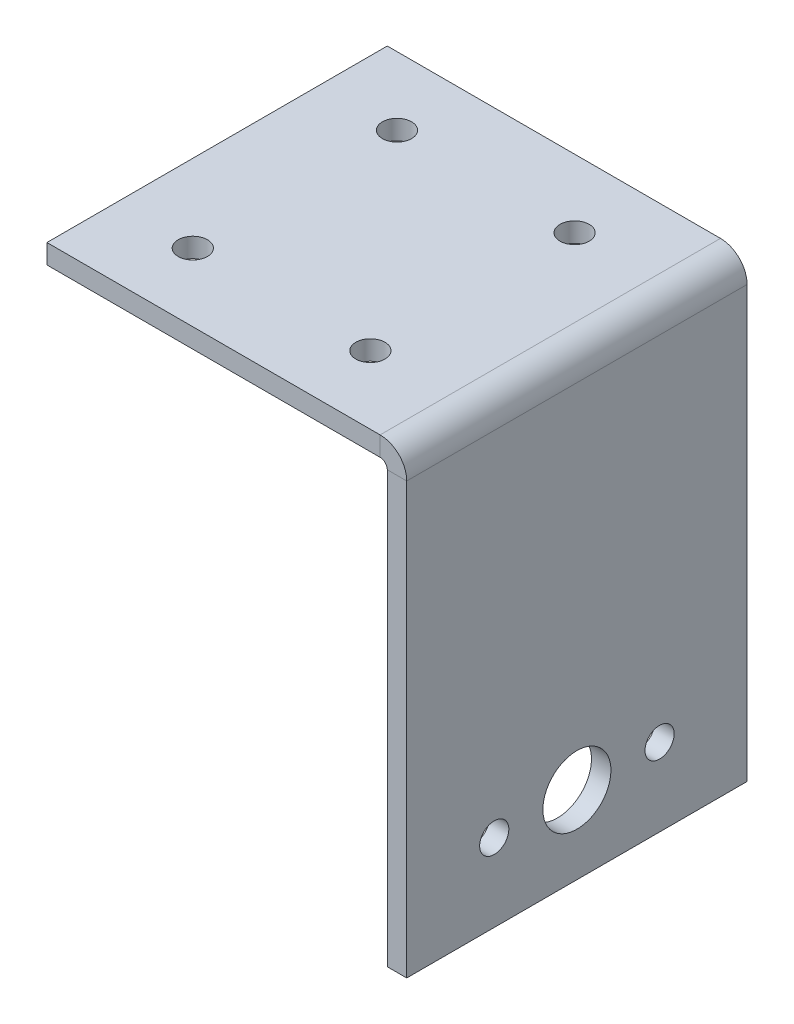
ISO-10303-21;
HEADER;
FILE_DESCRIPTION(('STEP AP214'),'2;1');
FILE_NAME('part.step','',(''),(''),'','','');
FILE_SCHEMA(('AUTOMOTIVE_DESIGN { 1 0 10303 214 1 1 1 1 }'));
ENDSEC;
DATA;
#1=APPLICATION_CONTEXT('core data for automotive mechanical design processes');
#2=APPLICATION_PROTOCOL_DEFINITION('international standard','automotive_design',2000,#1);
#3=PRODUCT_CONTEXT('',#1,'mechanical');
#4=PRODUCT('Part','Part','',(#3));
#5=PRODUCT_RELATED_PRODUCT_CATEGORY('part','',(#4));
#6=PRODUCT_DEFINITION_FORMATION('','',#4);
#7=PRODUCT_DEFINITION_CONTEXT('part definition',#1,'design');
#8=PRODUCT_DEFINITION('design','',#6,#7);
#9=PRODUCT_DEFINITION_SHAPE('','',#8);
#10=(LENGTH_UNIT() NAMED_UNIT(*) SI_UNIT(.MILLI.,.METRE.));
#11=(NAMED_UNIT(*) PLANE_ANGLE_UNIT() SI_UNIT($,.RADIAN.));
#12=(NAMED_UNIT(*) SI_UNIT($,.STERADIAN.) SOLID_ANGLE_UNIT());
#13=UNCERTAINTY_MEASURE_WITH_UNIT(LENGTH_MEASURE(1.E-05),#10,'distance_accuracy_value','');
#14=(GEOMETRIC_REPRESENTATION_CONTEXT(3) GLOBAL_UNCERTAINTY_ASSIGNED_CONTEXT((#13)) GLOBAL_UNIT_ASSIGNED_CONTEXT((#10,
#11,#12)) REPRESENTATION_CONTEXT('',''));
#15=CARTESIAN_POINT('',(0.,0.,0.));
#16=DIRECTION('',(0.,0.,1.));
#17=DIRECTION('',(1.,0.,0.));
#18=AXIS2_PLACEMENT_3D('',#15,#16,#17);
#19=CARTESIAN_POINT('',(-0.736599999999997,0.,35.));
#20=DIRECTION('',(0.,0.,1.));
#21=DIRECTION('',(1.,0.,0.));
#22=AXIS2_PLACEMENT_3D('',#19,#20,#21);
#23=PLANE('',#22);
#24=DIRECTION('',(0.,1.,0.));
#25=VECTOR('',#24,1.);
#26=CARTESIAN_POINT('',(-0.736599999999997,0.,35.));
#27=LINE('',#26,#25);
#28=CARTESIAN_POINT('',(-0.736599999999997,0.,35.));
#29=VERTEX_POINT('',#28);
#30=CARTESIAN_POINT('',(-0.736599999999993,2.,35.));
#31=VERTEX_POINT('',#30);
#32=EDGE_CURVE('E11',#29,#31,#27,.T.);
#33=ORIENTED_EDGE('',*,*,#32,.F.);
#34=CARTESIAN_POINT('',(-0.736599999999998,-0.7366,35.));
#35=DIRECTION('',(0.,0.,1.));
#36=DIRECTION('',(1.,0.,0.));
#37=AXIS2_PLACEMENT_3D('',#34,#35,#36);
#38=CIRCLE('',#37,0.7366);
#39=CARTESIAN_POINT('',(0.,-0.736599999999999,35.));
#40=VERTEX_POINT('',#39);
#41=EDGE_CURVE('E126',#29,#40,#38,.F.);
#42=ORIENTED_EDGE('',*,*,#41,.T.);
#43=DIRECTION('',(-1.,0.,0.));
#44=VECTOR('',#43,1.);
#45=CARTESIAN_POINT('',(2.,-0.736599999999999,35.));
#46=LINE('',#45,#44);
#47=CARTESIAN_POINT('',(2.,-0.736599999999999,35.));
#48=VERTEX_POINT('',#47);
#49=EDGE_CURVE('E44',#48,#40,#46,.T.);
#50=ORIENTED_EDGE('',*,*,#49,.F.);
#51=CARTESIAN_POINT('',(-0.736599999999998,-0.7366,35.));
#52=DIRECTION('',(0.,0.,1.));
#53=DIRECTION('',(1.,0.,0.));
#54=AXIS2_PLACEMENT_3D('',#51,#52,#53);
#55=CIRCLE('',#54,2.7366);
#56=EDGE_CURVE('E133',#31,#48,#55,.F.);
#57=ORIENTED_EDGE('',*,*,#56,.F.);
#58=EDGE_LOOP('',(#33,#42,#50,#57));
#59=FACE_BOUND('',#58,.T.);
#60=ADVANCED_FACE('F36',(#59),#23,.T.);
#61=CARTESIAN_POINT('',(2.,-0.736599999999999,35.));
#62=DIRECTION('',(0.,0.,1.));
#63=DIRECTION('',(1.,0.,0.));
#64=AXIS2_PLACEMENT_3D('',#61,#62,#63);
#65=PLANE('',#64);
#66=DIRECTION('',(1.,0.,0.));
#67=VECTOR('',#66,1.);
#68=CARTESIAN_POINT('',(-35.,0.,35.));
#69=LINE('',#68,#67);
#70=CARTESIAN_POINT('',(-35.,0.,35.));
#71=VERTEX_POINT('',#70);
#72=EDGE_CURVE('E121',#71,#29,#69,.T.);
#73=ORIENTED_EDGE('',*,*,#72,.T.);
#74=ORIENTED_EDGE('',*,*,#32,.T.);
#75=DIRECTION('',(1.,0.,0.));
#76=VECTOR('',#75,1.);
#77=CARTESIAN_POINT('',(-35.,2.,35.));
#78=LINE('',#77,#76);
#79=CARTESIAN_POINT('',(-35.,2.,35.));
#80=VERTEX_POINT('',#79);
#81=EDGE_CURVE('E131',#80,#31,#78,.T.);
#82=ORIENTED_EDGE('',*,*,#81,.F.);
#83=DIRECTION('',(0.,1.,0.));
#84=VECTOR('',#83,1.);
#85=CARTESIAN_POINT('',(-35.,0.,35.));
#86=LINE('',#85,#84);
#87=EDGE_CURVE('E112',#71,#80,#86,.T.);
#88=ORIENTED_EDGE('',*,*,#87,.F.);
#89=EDGE_LOOP('',(#73,#74,#82,#88));
#90=FACE_BOUND('',#89,.T.);
#91=ADVANCED_FACE('F129',(#90),#65,.T.);
#92=CARTESIAN_POINT('',(0.,-0.736599999999999,0.));
#93=DIRECTION('',(0.,0.,-1.));
#94=DIRECTION('',(-1.,0.,0.));
#95=AXIS2_PLACEMENT_3D('',#92,#93,#94);
#96=PLANE('',#95);
#97=DIRECTION('',(1.,0.,0.));
#98=VECTOR('',#97,1.);
#99=CARTESIAN_POINT('',(0.,-0.736599999999999,0.));
#100=LINE('',#99,#98);
#101=CARTESIAN_POINT('',(0.,-0.736599999999999,0.));
#102=VERTEX_POINT('',#101);
#103=CARTESIAN_POINT('',(2.,-0.736599999999999,0.));
#104=VERTEX_POINT('',#103);
#105=EDGE_CURVE('E87',#102,#104,#100,.T.);
#106=ORIENTED_EDGE('',*,*,#105,.F.);
#107=CARTESIAN_POINT('',(-0.736599999999998,-0.7366,0.));
#108=DIRECTION('',(0.,0.,1.));
#109=DIRECTION('',(1.,0.,0.));
#110=AXIS2_PLACEMENT_3D('',#107,#108,#109);
#111=CIRCLE('',#110,0.7366);
#112=CARTESIAN_POINT('',(-0.736599999999997,0.,0.));
#113=VERTEX_POINT('',#112);
#114=EDGE_CURVE('E156',#113,#102,#111,.F.);
#115=ORIENTED_EDGE('',*,*,#114,.F.);
#116=DIRECTION('',(0.,-1.,0.));
#117=VECTOR('',#116,1.);
#118=CARTESIAN_POINT('',(-0.736599999999993,2.,0.));
#119=LINE('',#118,#117);
#120=CARTESIAN_POINT('',(-0.736599999999993,2.,0.));
#121=VERTEX_POINT('',#120);
#122=EDGE_CURVE('E80',#121,#113,#119,.T.);
#123=ORIENTED_EDGE('',*,*,#122,.F.);
#124=CARTESIAN_POINT('',(-0.736599999999998,-0.7366,0.));
#125=DIRECTION('',(0.,0.,1.));
#126=DIRECTION('',(1.,0.,0.));
#127=AXIS2_PLACEMENT_3D('',#124,#125,#126);
#128=CIRCLE('',#127,2.7366);
#129=EDGE_CURVE('E149',#121,#104,#128,.F.);
#130=ORIENTED_EDGE('',*,*,#129,.T.);
#131=EDGE_LOOP('',(#106,#115,#123,#130));
#132=FACE_BOUND('',#131,.T.);
#133=ADVANCED_FACE('F188',(#132),#96,.T.);
#134=CARTESIAN_POINT('',(-0.736599999999993,2.,0.));
#135=DIRECTION('',(0.,0.,-1.));
#136=DIRECTION('',(-1.,0.,0.));
#137=AXIS2_PLACEMENT_3D('',#134,#135,#136);
#138=PLANE('',#137);
#139=DIRECTION('',(0.,-1.,0.));
#140=VECTOR('',#139,1.);
#141=CARTESIAN_POINT('',(0.,0.,0.));
#142=LINE('',#141,#140);
#143=CARTESIAN_POINT('',(0.,-45.,0.));
#144=VERTEX_POINT('',#143);
#145=EDGE_CURVE('E139',#102,#144,#142,.T.);
#146=ORIENTED_EDGE('',*,*,#145,.F.);
#147=ORIENTED_EDGE('',*,*,#105,.T.);
#148=DIRECTION('',(0.,-1.,0.));
#149=VECTOR('',#148,1.);
#150=CARTESIAN_POINT('',(2.,0.,0.));
#151=LINE('',#150,#149);
#152=CARTESIAN_POINT('',(2.00000000000001,-45.,0.));
#153=VERTEX_POINT('',#152);
#154=EDGE_CURVE('E146',#104,#153,#151,.T.);
#155=ORIENTED_EDGE('',*,*,#154,.T.);
#156=DIRECTION('',(-1.,0.,0.));
#157=VECTOR('',#156,1.);
#158=CARTESIAN_POINT('',(2.00000000000001,-45.,0.));
#159=LINE('',#158,#157);
#160=EDGE_CURVE('E142',#153,#144,#159,.T.);
#161=ORIENTED_EDGE('',*,*,#160,.T.);
#162=EDGE_LOOP('',(#146,#147,#155,#161));
#163=FACE_BOUND('',#162,.T.);
#164=ADVANCED_FACE('F175',(#163),#138,.T.);
#165=CARTESIAN_POINT('',(0.,0.,35.));
#166=DIRECTION('',(1.,0.,0.));
#167=DIRECTION('',(0.,1.,0.));
#168=AXIS2_PLACEMENT_3D('',#165,#166,#167);
#169=PLANE('',#168);
#170=CARTESIAN_POINT('',(0.,-37.,26.));
#171=DIRECTION('',(1.,0.,0.));
#172=DIRECTION('',(0.,1.,0.));
#173=AXIS2_PLACEMENT_3D('',#170,#171,#172);
#174=CIRCLE('',#173,1.5);
#175=CARTESIAN_POINT('',(0.,-35.5,26.));
#176=VERTEX_POINT('',#175);
#177=EDGE_CURVE('E233',#176,#176,#174,.T.);
#178=ORIENTED_EDGE('',*,*,#177,.T.);
#179=EDGE_LOOP('',(#178));
#180=FACE_BOUND('',#179,.T.);
#181=CARTESIAN_POINT('',(0.,-37.,9.));
#182=DIRECTION('',(1.,0.,0.));
#183=DIRECTION('',(0.,1.,0.));
#184=AXIS2_PLACEMENT_3D('',#181,#182,#183);
#185=CIRCLE('',#184,1.5);
#186=CARTESIAN_POINT('',(0.,-35.5,9.));
#187=VERTEX_POINT('',#186);
#188=EDGE_CURVE('E227',#187,#187,#185,.T.);
#189=ORIENTED_EDGE('',*,*,#188,.T.);
#190=EDGE_LOOP('',(#189));
#191=FACE_BOUND('',#190,.T.);
#192=CARTESIAN_POINT('',(0.,-37.,17.5));
#193=DIRECTION('',(1.,0.,0.));
#194=DIRECTION('',(0.,1.,0.));
#195=AXIS2_PLACEMENT_3D('',#192,#193,#194);
#196=CIRCLE('',#195,3.50000000000001);
#197=CARTESIAN_POINT('',(0.,-33.5,17.5));
#198=VERTEX_POINT('',#197);
#199=EDGE_CURVE('E210',#198,#198,#196,.T.);
#200=ORIENTED_EDGE('',*,*,#199,.T.);
#201=EDGE_LOOP('',(#200));
#202=FACE_BOUND('',#201,.T.);
#203=ORIENTED_EDGE('',*,*,#145,.T.);
#204=DIRECTION('',(0.,0.,-1.));
#205=VECTOR('',#204,1.);
#206=CARTESIAN_POINT('',(0.,-45.,35.));
#207=LINE('',#206,#205);
#208=CARTESIAN_POINT('',(0.,-45.,35.));
#209=VERTEX_POINT('',#208);
#210=EDGE_CURVE('E170',#209,#144,#207,.T.);
#211=ORIENTED_EDGE('',*,*,#210,.F.);
#212=DIRECTION('',(0.,-1.,0.));
#213=VECTOR('',#212,1.);
#214=CARTESIAN_POINT('',(0.,0.,35.));
#215=LINE('',#214,#213);
#216=EDGE_CURVE('E93',#40,#209,#215,.T.);
#217=ORIENTED_EDGE('',*,*,#216,.F.);
#218=DIRECTION('',(0.,0.,-1.));
#219=VECTOR('',#218,1.);
#220=CARTESIAN_POINT('',(0.,-0.736599999999999,35.));
#221=LINE('',#220,#219);
#222=EDGE_CURVE('E138',#40,#102,#221,.T.);
#223=ORIENTED_EDGE('',*,*,#222,.T.);
#224=EDGE_LOOP('',(#203,#211,#217,#223));
#225=FACE_BOUND('',#224,.T.);
#226=ADVANCED_FACE('F242',(#180,#191,#202,#225),#169,.F.);
#227=CARTESIAN_POINT('',(2.00000000000001,-45.,35.));
#228=DIRECTION('',(0.,-1.,0.));
#229=DIRECTION('',(0.,0.,-1.));
#230=AXIS2_PLACEMENT_3D('',#227,#228,#229);
#231=PLANE('',#230);
#232=ORIENTED_EDGE('',*,*,#160,.F.);
#233=DIRECTION('',(0.,0.,-1.));
#234=VECTOR('',#233,1.);
#235=CARTESIAN_POINT('',(2.00000000000001,-45.,35.));
#236=LINE('',#235,#234);
#237=CARTESIAN_POINT('',(2.00000000000001,-45.,35.));
#238=VERTEX_POINT('',#237);
#239=EDGE_CURVE('E168',#238,#153,#236,.T.);
#240=ORIENTED_EDGE('',*,*,#239,.F.);
#241=DIRECTION('',(-1.,0.,0.));
#242=VECTOR('',#241,1.);
#243=CARTESIAN_POINT('',(2.00000000000001,-45.,35.));
#244=LINE('',#243,#242);
#245=EDGE_CURVE('E194',#238,#209,#244,.T.);
#246=ORIENTED_EDGE('',*,*,#245,.T.);
#247=ORIENTED_EDGE('',*,*,#210,.T.);
#248=EDGE_LOOP('',(#232,#240,#246,#247));
#249=FACE_BOUND('',#248,.T.);
#250=ADVANCED_FACE('F255',(#249),#231,.T.);
#251=CARTESIAN_POINT('',(2.,0.,35.));
#252=DIRECTION('',(1.,0.,0.));
#253=DIRECTION('',(0.,1.,0.));
#254=AXIS2_PLACEMENT_3D('',#251,#252,#253);
#255=PLANE('',#254);
#256=CARTESIAN_POINT('',(2.,-37.,26.));
#257=DIRECTION('',(1.,0.,0.));
#258=DIRECTION('',(0.,1.,0.));
#259=AXIS2_PLACEMENT_3D('',#256,#257,#258);
#260=CIRCLE('',#259,1.5);
#261=CARTESIAN_POINT('',(2.,-35.5,26.));
#262=VERTEX_POINT('',#261);
#263=EDGE_CURVE('E230',#262,#262,#260,.T.);
#264=ORIENTED_EDGE('',*,*,#263,.F.);
#265=EDGE_LOOP('',(#264));
#266=FACE_BOUND('',#265,.T.);
#267=CARTESIAN_POINT('',(2.,-37.,9.));
#268=DIRECTION('',(1.,0.,0.));
#269=DIRECTION('',(0.,1.,0.));
#270=AXIS2_PLACEMENT_3D('',#267,#268,#269);
#271=CIRCLE('',#270,1.5);
#272=CARTESIAN_POINT('',(2.,-35.5,9.));
#273=VERTEX_POINT('',#272);
#274=EDGE_CURVE('E236',#273,#273,#271,.T.);
#275=ORIENTED_EDGE('',*,*,#274,.F.);
#276=EDGE_LOOP('',(#275));
#277=FACE_BOUND('',#276,.T.);
#278=CARTESIAN_POINT('',(2.,-37.,17.5));
#279=DIRECTION('',(1.,0.,0.));
#280=DIRECTION('',(0.,1.,0.));
#281=AXIS2_PLACEMENT_3D('',#278,#279,#280);
#282=CIRCLE('',#281,3.50000000000001);
#283=CARTESIAN_POINT('',(2.,-33.5,17.5));
#284=VERTEX_POINT('',#283);
#285=EDGE_CURVE('E224',#284,#284,#282,.T.);
#286=ORIENTED_EDGE('',*,*,#285,.F.);
#287=EDGE_LOOP('',(#286));
#288=FACE_BOUND('',#287,.T.);
#289=ORIENTED_EDGE('',*,*,#154,.F.);
#290=DIRECTION('',(0.,0.,-1.));
#291=VECTOR('',#290,1.);
#292=CARTESIAN_POINT('',(2.,-0.736599999999999,35.));
#293=LINE('',#292,#291);
#294=EDGE_CURVE('E165',#48,#104,#293,.T.);
#295=ORIENTED_EDGE('',*,*,#294,.F.);
#296=DIRECTION('',(0.,-1.,0.));
#297=VECTOR('',#296,1.);
#298=CARTESIAN_POINT('',(2.,0.,35.));
#299=LINE('',#298,#297);
#300=EDGE_CURVE('E193',#48,#238,#299,.T.);
#301=ORIENTED_EDGE('',*,*,#300,.T.);
#302=ORIENTED_EDGE('',*,*,#239,.T.);
#303=EDGE_LOOP('',(#289,#295,#301,#302));
#304=FACE_BOUND('',#303,.T.);
#305=ADVANCED_FACE('F186',(#266,#277,#288,#304),#255,.T.);
#306=CARTESIAN_POINT('',(-0.736599999999998,-0.7366,35.));
#307=DIRECTION('',(0.,0.,-1.));
#308=DIRECTION('',(-1.,0.,0.));
#309=AXIS2_PLACEMENT_3D('',#306,#307,#308);
#310=CYLINDRICAL_SURFACE('',#309,2.7366);
#311=ORIENTED_EDGE('',*,*,#129,.F.);
#312=DIRECTION('',(0.,0.,-1.));
#313=VECTOR('',#312,1.);
#314=CARTESIAN_POINT('',(-0.736599999999993,2.,35.));
#315=LINE('',#314,#313);
#316=EDGE_CURVE('E162',#31,#121,#315,.T.);
#317=ORIENTED_EDGE('',*,*,#316,.F.);
#318=ORIENTED_EDGE('',*,*,#56,.T.);
#319=ORIENTED_EDGE('',*,*,#294,.T.);
#320=EDGE_LOOP('',(#311,#317,#318,#319));
#321=FACE_BOUND('',#320,.T.);
#322=ADVANCED_FACE('F181',(#321),#310,.T.);
#323=CARTESIAN_POINT('',(-35.,2.,35.));
#324=DIRECTION('',(0.,1.,0.));
#325=DIRECTION('',(0.,0.,1.));
#326=AXIS2_PLACEMENT_3D('',#323,#324,#325);
#327=PLANE('',#326);
#328=CARTESIAN_POINT('',(-27.,2.,28.));
#329=DIRECTION('',(0.,1.,0.));
#330=DIRECTION('',(0.,0.,1.));
#331=AXIS2_PLACEMENT_3D('',#328,#329,#330);
#332=CIRCLE('',#331,1.5);
#333=CARTESIAN_POINT('',(-27.,2.,29.5));
#334=VERTEX_POINT('',#333);
#335=EDGE_CURVE('E206',#334,#334,#332,.T.);
#336=ORIENTED_EDGE('',*,*,#335,.F.);
#337=EDGE_LOOP('',(#336));
#338=FACE_BOUND('',#337,.T.);
#339=CARTESIAN_POINT('',(-8.73659999999999,2.,28.));
#340=DIRECTION('',(0.,1.,0.));
#341=DIRECTION('',(0.,0.,1.));
#342=AXIS2_PLACEMENT_3D('',#339,#340,#341);
#343=CIRCLE('',#342,1.5);
#344=CARTESIAN_POINT('',(-8.73659999999999,2.,29.5));
#345=VERTEX_POINT('',#344);
#346=EDGE_CURVE('E213',#345,#345,#343,.T.);
#347=ORIENTED_EDGE('',*,*,#346,.F.);
#348=EDGE_LOOP('',(#347));
#349=FACE_BOUND('',#348,.T.);
#350=CARTESIAN_POINT('',(-8.73659999999999,2.,7.));
#351=DIRECTION('',(0.,1.,0.));
#352=DIRECTION('',(0.,0.,1.));
#353=AXIS2_PLACEMENT_3D('',#350,#351,#352);
#354=CIRCLE('',#353,1.5);
#355=CARTESIAN_POINT('',(-8.73659999999999,2.,8.5));
#356=VERTEX_POINT('',#355);
#357=EDGE_CURVE('E219',#356,#356,#354,.T.);
#358=ORIENTED_EDGE('',*,*,#357,.F.);
#359=EDGE_LOOP('',(#358));
#360=FACE_BOUND('',#359,.T.);
#361=CARTESIAN_POINT('',(-27.,2.,7.));
#362=DIRECTION('',(0.,1.,0.));
#363=DIRECTION('',(0.,0.,1.));
#364=AXIS2_PLACEMENT_3D('',#361,#362,#363);
#365=CIRCLE('',#364,1.5);
#366=CARTESIAN_POINT('',(-27.,2.,8.5));
#367=VERTEX_POINT('',#366);
#368=EDGE_CURVE('E200',#367,#367,#365,.T.);
#369=ORIENTED_EDGE('',*,*,#368,.F.);
#370=EDGE_LOOP('',(#369));
#371=FACE_BOUND('',#370,.T.);
#372=DIRECTION('',(1.,0.,0.));
#373=VECTOR('',#372,1.);
#374=CARTESIAN_POINT('',(-35.,2.,0.));
#375=LINE('',#374,#373);
#376=CARTESIAN_POINT('',(-35.,2.,0.));
#377=VERTEX_POINT('',#376);
#378=EDGE_CURVE('E151',#377,#121,#375,.T.);
#379=ORIENTED_EDGE('',*,*,#378,.F.);
#380=DIRECTION('',(0.,0.,-1.));
#381=VECTOR('',#380,1.);
#382=CARTESIAN_POINT('',(-35.,2.,35.));
#383=LINE('',#382,#381);
#384=EDGE_CURVE('E116',#80,#377,#383,.T.);
#385=ORIENTED_EDGE('',*,*,#384,.F.);
#386=ORIENTED_EDGE('',*,*,#81,.T.);
#387=ORIENTED_EDGE('',*,*,#316,.T.);
#388=EDGE_LOOP('',(#379,#385,#386,#387));
#389=FACE_BOUND('',#388,.T.);
#390=ADVANCED_FACE('F191',(#338,#349,#360,#371,#389),#327,.T.);
#391=CARTESIAN_POINT('',(-35.,0.,35.));
#392=DIRECTION('',(-1.,0.,0.));
#393=DIRECTION('',(0.,0.,1.));
#394=AXIS2_PLACEMENT_3D('',#391,#392,#393);
#395=PLANE('',#394);
#396=DIRECTION('',(0.,1.,0.));
#397=VECTOR('',#396,1.);
#398=CARTESIAN_POINT('',(-35.,0.,0.));
#399=LINE('',#398,#397);
#400=CARTESIAN_POINT('',(-35.,0.,0.));
#401=VERTEX_POINT('',#400);
#402=EDGE_CURVE('E114',#401,#377,#399,.T.);
#403=ORIENTED_EDGE('',*,*,#402,.F.);
#404=DIRECTION('',(0.,0.,-1.));
#405=VECTOR('',#404,1.);
#406=CARTESIAN_POINT('',(-35.,0.,35.));
#407=LINE('',#406,#405);
#408=EDGE_CURVE('E108',#71,#401,#407,.T.);
#409=ORIENTED_EDGE('',*,*,#408,.F.);
#410=ORIENTED_EDGE('',*,*,#87,.T.);
#411=ORIENTED_EDGE('',*,*,#384,.T.);
#412=EDGE_LOOP('',(#403,#409,#410,#411));
#413=FACE_BOUND('',#412,.T.);
#414=ADVANCED_FACE('F110',(#413),#395,.T.);
#415=CARTESIAN_POINT('',(-35.,0.,35.));
#416=DIRECTION('',(0.,1.,0.));
#417=DIRECTION('',(0.,0.,1.));
#418=AXIS2_PLACEMENT_3D('',#415,#416,#417);
#419=PLANE('',#418);
#420=CARTESIAN_POINT('',(-27.,0.,28.));
#421=DIRECTION('',(0.,1.,0.));
#422=DIRECTION('',(0.,0.,1.));
#423=AXIS2_PLACEMENT_3D('',#420,#421,#422);
#424=CIRCLE('',#423,1.5);
#425=CARTESIAN_POINT('',(-27.,0.,29.5));
#426=VERTEX_POINT('',#425);
#427=EDGE_CURVE('E209',#426,#426,#424,.T.);
#428=ORIENTED_EDGE('',*,*,#427,.T.);
#429=EDGE_LOOP('',(#428));
#430=FACE_BOUND('',#429,.T.);
#431=CARTESIAN_POINT('',(-8.73659999999999,0.,28.));
#432=DIRECTION('',(0.,1.,0.));
#433=DIRECTION('',(0.,0.,1.));
#434=AXIS2_PLACEMENT_3D('',#431,#432,#433);
#435=CIRCLE('',#434,1.5);
#436=CARTESIAN_POINT('',(-8.73659999999999,0.,29.5));
#437=VERTEX_POINT('',#436);
#438=EDGE_CURVE('E216',#437,#437,#435,.T.);
#439=ORIENTED_EDGE('',*,*,#438,.T.);
#440=EDGE_LOOP('',(#439));
#441=FACE_BOUND('',#440,.T.);
#442=CARTESIAN_POINT('',(-8.73659999999999,0.,7.));
#443=DIRECTION('',(0.,1.,0.));
#444=DIRECTION('',(0.,0.,1.));
#445=AXIS2_PLACEMENT_3D('',#442,#443,#444);
#446=CIRCLE('',#445,1.5);
#447=CARTESIAN_POINT('',(-8.73659999999999,0.,8.5));
#448=VERTEX_POINT('',#447);
#449=EDGE_CURVE('E203',#448,#448,#446,.T.);
#450=ORIENTED_EDGE('',*,*,#449,.T.);
#451=EDGE_LOOP('',(#450));
#452=FACE_BOUND('',#451,.T.);
#453=CARTESIAN_POINT('',(-27.,0.,7.));
#454=DIRECTION('',(0.,1.,0.));
#455=DIRECTION('',(0.,0.,1.));
#456=AXIS2_PLACEMENT_3D('',#453,#454,#455);
#457=CIRCLE('',#456,1.5);
#458=CARTESIAN_POINT('',(-27.,0.,8.5));
#459=VERTEX_POINT('',#458);
#460=EDGE_CURVE('E143',#459,#459,#457,.T.);
#461=ORIENTED_EDGE('',*,*,#460,.T.);
#462=EDGE_LOOP('',(#461));
#463=FACE_BOUND('',#462,.T.);
#464=DIRECTION('',(1.,0.,0.));
#465=VECTOR('',#464,1.);
#466=CARTESIAN_POINT('',(-35.,0.,0.));
#467=LINE('',#466,#465);
#468=EDGE_CURVE('E154',#401,#113,#467,.T.);
#469=ORIENTED_EDGE('',*,*,#468,.T.);
#470=DIRECTION('',(0.,0.,-1.));
#471=VECTOR('',#470,1.);
#472=CARTESIAN_POINT('',(-0.736599999999997,0.,35.));
#473=LINE('',#472,#471);
#474=EDGE_CURVE('E117',#29,#113,#473,.T.);
#475=ORIENTED_EDGE('',*,*,#474,.F.);
#476=ORIENTED_EDGE('',*,*,#72,.F.);
#477=ORIENTED_EDGE('',*,*,#408,.T.);
#478=EDGE_LOOP('',(#469,#475,#476,#477));
#479=FACE_BOUND('',#478,.T.);
#480=ADVANCED_FACE('F122',(#430,#441,#452,#463,#479),#419,.F.);
#481=CARTESIAN_POINT('',(-0.736599999999998,-0.7366,35.));
#482=DIRECTION('',(0.,0.,-1.));
#483=DIRECTION('',(-1.,0.,0.));
#484=AXIS2_PLACEMENT_3D('',#481,#482,#483);
#485=CYLINDRICAL_SURFACE('',#484,0.7366);
#486=ORIENTED_EDGE('',*,*,#114,.T.);
#487=ORIENTED_EDGE('',*,*,#222,.F.);
#488=ORIENTED_EDGE('',*,*,#41,.F.);
#489=ORIENTED_EDGE('',*,*,#474,.T.);
#490=EDGE_LOOP('',(#486,#487,#488,#489));
#491=FACE_BOUND('',#490,.T.);
#492=ADVANCED_FACE('F299',(#491),#485,.F.);
#493=CARTESIAN_POINT('',(-0.736599999999998,-0.7366,35.));
#494=DIRECTION('',(0.,0.,1.));
#495=DIRECTION('',(1.,0.,0.));
#496=AXIS2_PLACEMENT_3D('',#493,#494,#495);
#497=PLANE('',#496);
#498=ORIENTED_EDGE('',*,*,#216,.T.);
#499=ORIENTED_EDGE('',*,*,#245,.F.);
#500=ORIENTED_EDGE('',*,*,#300,.F.);
#501=ORIENTED_EDGE('',*,*,#49,.T.);
#502=EDGE_LOOP('',(#498,#499,#500,#501));
#503=FACE_BOUND('',#502,.T.);
#504=ADVANCED_FACE('F303',(#503),#497,.T.);
#505=CARTESIAN_POINT('',(-0.736599999999998,-0.7366,0.));
#506=DIRECTION('',(0.,0.,1.));
#507=DIRECTION('',(1.,0.,0.));
#508=AXIS2_PLACEMENT_3D('',#505,#506,#507);
#509=PLANE('',#508);
#510=ORIENTED_EDGE('',*,*,#378,.T.);
#511=ORIENTED_EDGE('',*,*,#122,.T.);
#512=ORIENTED_EDGE('',*,*,#468,.F.);
#513=ORIENTED_EDGE('',*,*,#402,.T.);
#514=EDGE_LOOP('',(#510,#511,#512,#513));
#515=FACE_BOUND('',#514,.T.);
#516=ADVANCED_FACE('F305',(#515),#509,.F.);
#517=CARTESIAN_POINT('',(-27.,0.,7.));
#518=DIRECTION('',(0.,1.,0.));
#519=DIRECTION('',(0.,0.,1.));
#520=AXIS2_PLACEMENT_3D('',#517,#518,#519);
#521=CYLINDRICAL_SURFACE('',#520,1.5);
#522=ORIENTED_EDGE('',*,*,#460,.F.);
#523=EDGE_LOOP('',(#522));
#524=FACE_BOUND('',#523,.T.);
#525=ORIENTED_EDGE('',*,*,#368,.T.);
#526=EDGE_LOOP('',(#525));
#527=FACE_BOUND('',#526,.T.);
#528=ADVANCED_FACE('F308',(#524,#527),#521,.F.);
#529=CARTESIAN_POINT('',(-8.73659999999999,0.,7.));
#530=DIRECTION('',(0.,1.,0.));
#531=DIRECTION('',(0.,0.,1.));
#532=AXIS2_PLACEMENT_3D('',#529,#530,#531);
#533=CYLINDRICAL_SURFACE('',#532,1.5);
#534=ORIENTED_EDGE('',*,*,#449,.F.);
#535=EDGE_LOOP('',(#534));
#536=FACE_BOUND('',#535,.T.);
#537=ORIENTED_EDGE('',*,*,#357,.T.);
#538=EDGE_LOOP('',(#537));
#539=FACE_BOUND('',#538,.T.);
#540=ADVANCED_FACE('F312',(#536,#539),#533,.F.);
#541=CARTESIAN_POINT('',(-8.73659999999999,0.,28.));
#542=DIRECTION('',(0.,1.,0.));
#543=DIRECTION('',(0.,0.,1.));
#544=AXIS2_PLACEMENT_3D('',#541,#542,#543);
#545=CYLINDRICAL_SURFACE('',#544,1.5);
#546=ORIENTED_EDGE('',*,*,#438,.F.);
#547=EDGE_LOOP('',(#546));
#548=FACE_BOUND('',#547,.T.);
#549=ORIENTED_EDGE('',*,*,#346,.T.);
#550=EDGE_LOOP('',(#549));
#551=FACE_BOUND('',#550,.T.);
#552=ADVANCED_FACE('F267',(#548,#551),#545,.F.);
#553=CARTESIAN_POINT('',(-27.,0.,28.));
#554=DIRECTION('',(0.,1.,0.));
#555=DIRECTION('',(0.,0.,1.));
#556=AXIS2_PLACEMENT_3D('',#553,#554,#555);
#557=CYLINDRICAL_SURFACE('',#556,1.5);
#558=ORIENTED_EDGE('',*,*,#427,.F.);
#559=EDGE_LOOP('',(#558));
#560=FACE_BOUND('',#559,.T.);
#561=ORIENTED_EDGE('',*,*,#335,.T.);
#562=EDGE_LOOP('',(#561));
#563=FACE_BOUND('',#562,.T.);
#564=ADVANCED_FACE('F261',(#560,#563),#557,.F.);
#565=CARTESIAN_POINT('',(0.,-37.,17.5));
#566=DIRECTION('',(1.,0.,0.));
#567=DIRECTION('',(0.,1.,0.));
#568=AXIS2_PLACEMENT_3D('',#565,#566,#567);
#569=CYLINDRICAL_SURFACE('',#568,3.50000000000001);
#570=ORIENTED_EDGE('',*,*,#199,.F.);
#571=EDGE_LOOP('',(#570));
#572=FACE_BOUND('',#571,.T.);
#573=ORIENTED_EDGE('',*,*,#285,.T.);
#574=EDGE_LOOP('',(#573));
#575=FACE_BOUND('',#574,.T.);
#576=ADVANCED_FACE('F249',(#572,#575),#569,.F.);
#577=CARTESIAN_POINT('',(0.,-37.,9.));
#578=DIRECTION('',(1.,0.,0.));
#579=DIRECTION('',(0.,1.,0.));
#580=AXIS2_PLACEMENT_3D('',#577,#578,#579);
#581=CYLINDRICAL_SURFACE('',#580,1.5);
#582=ORIENTED_EDGE('',*,*,#188,.F.);
#583=EDGE_LOOP('',(#582));
#584=FACE_BOUND('',#583,.T.);
#585=ORIENTED_EDGE('',*,*,#274,.T.);
#586=EDGE_LOOP('',(#585));
#587=FACE_BOUND('',#586,.T.);
#588=ADVANCED_FACE('F245',(#584,#587),#581,.F.);
#589=CARTESIAN_POINT('',(0.,-37.,26.));
#590=DIRECTION('',(1.,0.,0.));
#591=DIRECTION('',(0.,1.,0.));
#592=AXIS2_PLACEMENT_3D('',#589,#590,#591);
#593=CYLINDRICAL_SURFACE('',#592,1.5);
#594=ORIENTED_EDGE('',*,*,#177,.F.);
#595=EDGE_LOOP('',(#594));
#596=FACE_BOUND('',#595,.T.);
#597=ORIENTED_EDGE('',*,*,#263,.T.);
#598=EDGE_LOOP('',(#597));
#599=FACE_BOUND('',#598,.T.);
#600=ADVANCED_FACE('F248',(#596,#599),#593,.F.);
#601=CLOSED_SHELL('',(#60,#91,#133,#164,#226,#250,#305,#322,#390,#414,#480,#492,#504,#516,#528,
#540,#552,#564,#576,#588,#600));
#602=MANIFOLD_SOLID_BREP('B2',#601);
#603=ADVANCED_BREP_SHAPE_REPRESENTATION('',(#18,#602),#14);
#604=SHAPE_DEFINITION_REPRESENTATION(#9,#603);
ENDSEC;
END-ISO-10303-21;
